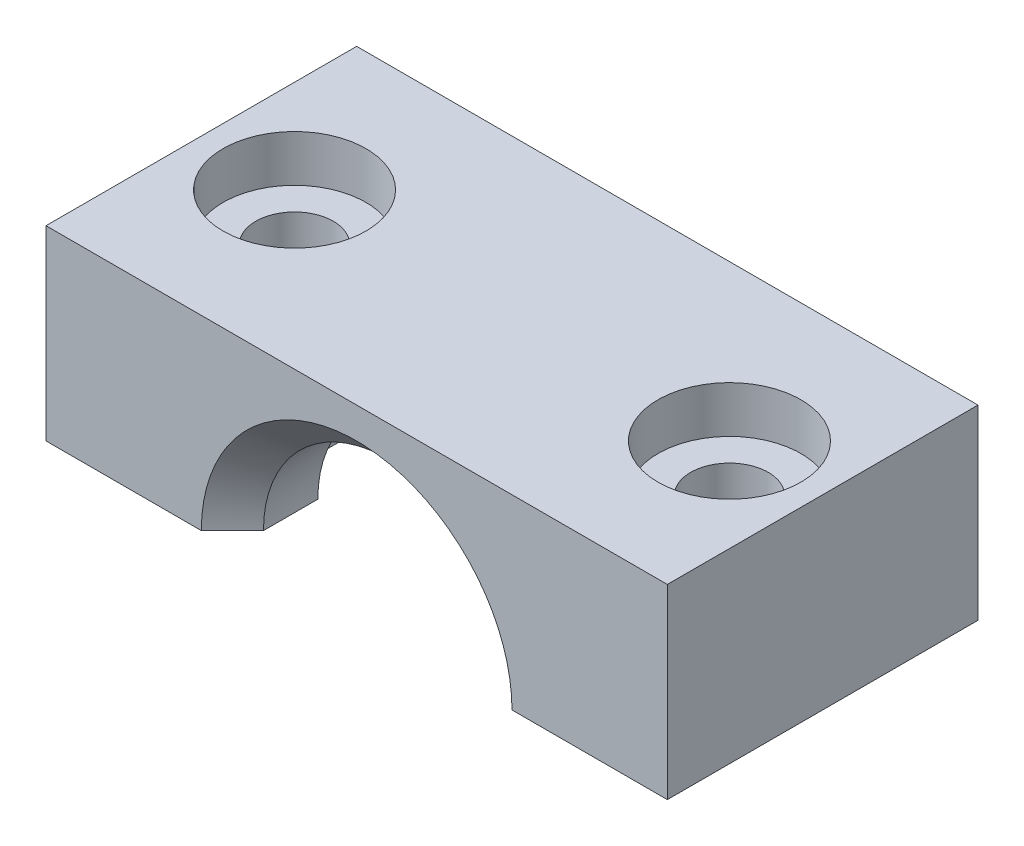
ISO-10303-21;
HEADER;
FILE_DESCRIPTION(('STEP AP214'),'2;1');
FILE_NAME('part.step','',(''),(''),'','','');
FILE_SCHEMA(('AUTOMOTIVE_DESIGN { 1 0 10303 214 1 1 1 1 }'));
ENDSEC;
DATA;
#1=APPLICATION_CONTEXT('core data for automotive mechanical design processes');
#2=APPLICATION_PROTOCOL_DEFINITION('international standard','automotive_design',2000,#1);
#3=PRODUCT_CONTEXT('',#1,'mechanical');
#4=PRODUCT('Part','Part','',(#3));
#5=PRODUCT_RELATED_PRODUCT_CATEGORY('part','',(#4));
#6=PRODUCT_DEFINITION_FORMATION('','',#4);
#7=PRODUCT_DEFINITION_CONTEXT('part definition',#1,'design');
#8=PRODUCT_DEFINITION('design','',#6,#7);
#9=PRODUCT_DEFINITION_SHAPE('','',#8);
#10=(LENGTH_UNIT() NAMED_UNIT(*) SI_UNIT(.MILLI.,.METRE.));
#11=(NAMED_UNIT(*) PLANE_ANGLE_UNIT() SI_UNIT($,.RADIAN.));
#12=(NAMED_UNIT(*) SI_UNIT($,.STERADIAN.) SOLID_ANGLE_UNIT());
#13=UNCERTAINTY_MEASURE_WITH_UNIT(LENGTH_MEASURE(1.E-05),#10,'distance_accuracy_value','');
#14=(GEOMETRIC_REPRESENTATION_CONTEXT(3) GLOBAL_UNCERTAINTY_ASSIGNED_CONTEXT((#13)) GLOBAL_UNIT_ASSIGNED_CONTEXT((#10,
#11,#12)) REPRESENTATION_CONTEXT('',''));
#15=CARTESIAN_POINT('',(0.,0.,0.));
#16=DIRECTION('',(0.,0.,1.));
#17=DIRECTION('',(1.,0.,0.));
#18=AXIS2_PLACEMENT_3D('',#15,#16,#17);
#19=CARTESIAN_POINT('',(-7.,0.,0.));
#20=DIRECTION('',(0.,1.,0.));
#21=DIRECTION('',(0.,0.,1.));
#22=AXIS2_PLACEMENT_3D('',#19,#20,#21);
#23=CYLINDRICAL_SURFACE('',#22,1.25);
#24=CARTESIAN_POINT('',(-7.,0.,0.));
#25=DIRECTION('',(0.,1.,0.));
#26=DIRECTION('',(0.,0.,1.));
#27=AXIS2_PLACEMENT_3D('',#24,#25,#26);
#28=CIRCLE('',#27,1.25);
#29=CARTESIAN_POINT('',(-7.,0.,1.25));
#30=VERTEX_POINT('',#29);
#31=EDGE_CURVE('E144',#30,#30,#28,.T.);
#32=ORIENTED_EDGE('',*,*,#31,.F.);
#33=EDGE_LOOP('',(#32));
#34=FACE_BOUND('',#33,.T.);
#35=CARTESIAN_POINT('',(-7.,4.5,0.));
#36=DIRECTION('',(0.,1.,0.));
#37=DIRECTION('',(0.,0.,1.));
#38=AXIS2_PLACEMENT_3D('',#35,#36,#37);
#39=CIRCLE('',#38,1.25);
#40=CARTESIAN_POINT('',(-7.,4.5,1.25));
#41=VERTEX_POINT('',#40);
#42=EDGE_CURVE('E38',#41,#41,#39,.F.);
#43=ORIENTED_EDGE('',*,*,#42,.F.);
#44=EDGE_LOOP('',(#43));
#45=FACE_BOUND('',#44,.T.);
#46=ADVANCED_FACE('F34',(#34,#45),#23,.F.);
#47=CARTESIAN_POINT('',(7.,0.,0.));
#48=DIRECTION('',(0.,1.,0.));
#49=DIRECTION('',(0.,0.,1.));
#50=AXIS2_PLACEMENT_3D('',#47,#48,#49);
#51=CYLINDRICAL_SURFACE('',#50,1.25);
#52=CARTESIAN_POINT('',(7.,0.,0.));
#53=DIRECTION('',(0.,1.,0.));
#54=DIRECTION('',(0.,0.,1.));
#55=AXIS2_PLACEMENT_3D('',#52,#53,#54);
#56=CIRCLE('',#55,1.25);
#57=CARTESIAN_POINT('',(7.,0.,1.25));
#58=VERTEX_POINT('',#57);
#59=EDGE_CURVE('E219',#58,#58,#56,.T.);
#60=ORIENTED_EDGE('',*,*,#59,.F.);
#61=EDGE_LOOP('',(#60));
#62=FACE_BOUND('',#61,.T.);
#63=CARTESIAN_POINT('',(7.,4.5,0.));
#64=DIRECTION('',(0.,1.,0.));
#65=DIRECTION('',(0.,0.,1.));
#66=AXIS2_PLACEMENT_3D('',#63,#64,#65);
#67=CIRCLE('',#66,1.25);
#68=CARTESIAN_POINT('',(7.,4.5,1.25));
#69=VERTEX_POINT('',#68);
#70=EDGE_CURVE('E213',#69,#69,#67,.F.);
#71=ORIENTED_EDGE('',*,*,#70,.F.);
#72=EDGE_LOOP('',(#71));
#73=FACE_BOUND('',#72,.T.);
#74=ADVANCED_FACE('F244',(#62,#73),#51,.F.);
#75=CARTESIAN_POINT('',(-10.,0.,5.));
#76=DIRECTION('',(0.,1.,0.));
#77=DIRECTION('',(-1.,0.,0.));
#78=AXIS2_PLACEMENT_3D('',#75,#76,#77);
#79=PLANE('',#78);
#80=ORIENTED_EDGE('',*,*,#31,.T.);
#81=EDGE_LOOP('',(#80));
#82=FACE_BOUND('',#81,.T.);
#83=DIRECTION('',(1.,0.,0.));
#84=VECTOR('',#83,1.);
#85=CARTESIAN_POINT('',(-10.,0.,-5.));
#86=LINE('',#85,#84);
#87=CARTESIAN_POINT('',(-10.,0.,-5.));
#88=VERTEX_POINT('',#87);
#89=CARTESIAN_POINT('',(-5.,0.,-5.));
#90=VERTEX_POINT('',#89);
#91=EDGE_CURVE('E181',#88,#90,#86,.T.);
#92=ORIENTED_EDGE('',*,*,#91,.T.);
#93=DIRECTION('',(0.707106781186546,0.,0.707106781186549));
#94=VECTOR('',#93,1.);
#95=CARTESIAN_POINT('',(0.,0.,0.));
#96=LINE('',#95,#94);
#97=CARTESIAN_POINT('',(-4.,0.,-3.99999999999999));
#98=VERTEX_POINT('',#97);
#99=EDGE_CURVE('E205',#90,#98,#96,.T.);
#100=ORIENTED_EDGE('',*,*,#99,.T.);
#101=DIRECTION('',(0.,0.,1.));
#102=VECTOR('',#101,1.);
#103=CARTESIAN_POINT('',(-4.,0.,-5.));
#104=LINE('',#103,#102);
#105=CARTESIAN_POINT('',(-4.,0.,-2.25));
#106=VERTEX_POINT('',#105);
#107=EDGE_CURVE('E163',#98,#106,#104,.T.);
#108=ORIENTED_EDGE('',*,*,#107,.T.);
#109=DIRECTION('',(1.,0.,0.));
#110=VECTOR('',#109,1.);
#111=CARTESIAN_POINT('',(-10.,0.,-2.25));
#112=LINE('',#111,#110);
#113=CARTESIAN_POINT('',(-5.25,0.,-2.25));
#114=VERTEX_POINT('',#113);
#115=EDGE_CURVE('E155',#114,#106,#112,.T.);
#116=ORIENTED_EDGE('',*,*,#115,.F.);
#117=DIRECTION('',(0.,0.,1.));
#118=VECTOR('',#117,1.);
#119=CARTESIAN_POINT('',(-5.25,0.,-2.25));
#120=LINE('',#119,#118);
#121=CARTESIAN_POINT('',(-5.25,0.,2.25));
#122=VERTEX_POINT('',#121);
#123=EDGE_CURVE('E158',#114,#122,#120,.T.);
#124=ORIENTED_EDGE('',*,*,#123,.T.);
#125=DIRECTION('',(1.,0.,0.));
#126=VECTOR('',#125,1.);
#127=CARTESIAN_POINT('',(-10.,0.,2.25));
#128=LINE('',#127,#126);
#129=CARTESIAN_POINT('',(-4.,0.,2.25));
#130=VERTEX_POINT('',#129);
#131=EDGE_CURVE('E143',#122,#130,#128,.T.);
#132=ORIENTED_EDGE('',*,*,#131,.T.);
#133=CARTESIAN_POINT('',(-4.,0.,3.99999999999999));
#134=VERTEX_POINT('',#133);
#135=EDGE_CURVE('E162',#130,#134,#104,.T.);
#136=ORIENTED_EDGE('',*,*,#135,.T.);
#137=DIRECTION('',(-0.707106781186549,0.,0.707106781186546));
#138=VECTOR('',#137,1.);
#139=CARTESIAN_POINT('',(0.,0.,0.));
#140=LINE('',#139,#138);
#141=CARTESIAN_POINT('',(-5.00000000000001,0.,5.));
#142=VERTEX_POINT('',#141);
#143=EDGE_CURVE('E203',#134,#142,#140,.T.);
#144=ORIENTED_EDGE('',*,*,#143,.T.);
#145=DIRECTION('',(1.,0.,0.));
#146=VECTOR('',#145,1.);
#147=CARTESIAN_POINT('',(-10.,0.,5.));
#148=LINE('',#147,#146);
#149=CARTESIAN_POINT('',(-10.,0.,5.));
#150=VERTEX_POINT('',#149);
#151=EDGE_CURVE('E171',#150,#142,#148,.T.);
#152=ORIENTED_EDGE('',*,*,#151,.F.);
#153=DIRECTION('',(0.,0.,-1.));
#154=VECTOR('',#153,1.);
#155=CARTESIAN_POINT('',(-10.,0.,5.));
#156=LINE('',#155,#154);
#157=EDGE_CURVE('E195',#150,#88,#156,.T.);
#158=ORIENTED_EDGE('',*,*,#157,.T.);
#159=EDGE_LOOP('',(#92,#100,#108,#116,#124,#132,#136,#144,#152,#158));
#160=FACE_BOUND('',#159,.T.);
#161=ADVANCED_FACE('F239',(#82,#160),#79,.F.);
#162=ORIENTED_EDGE('',*,*,#59,.T.);
#163=EDGE_LOOP('',(#162));
#164=FACE_BOUND('',#163,.T.);
#165=DIRECTION('',(0.,0.,1.));
#166=VECTOR('',#165,1.);
#167=CARTESIAN_POINT('',(4.,0.,-5.));
#168=LINE('',#167,#166);
#169=CARTESIAN_POINT('',(4.,0.,-2.25));
#170=VERTEX_POINT('',#169);
#171=CARTESIAN_POINT('',(4.,0.,-3.99999999999999));
#172=VERTEX_POINT('',#171);
#173=EDGE_CURVE('E160',#170,#172,#168,.F.);
#174=ORIENTED_EDGE('',*,*,#173,.T.);
#175=DIRECTION('',(0.707106781186546,0.,-0.707106781186549));
#176=VECTOR('',#175,1.);
#177=CARTESIAN_POINT('',(0.,0.,0.));
#178=LINE('',#177,#176);
#179=CARTESIAN_POINT('',(5.,0.,-5.));
#180=VERTEX_POINT('',#179);
#181=EDGE_CURVE('E210',#172,#180,#178,.T.);
#182=ORIENTED_EDGE('',*,*,#181,.T.);
#183=CARTESIAN_POINT('',(10.,0.,-5.));
#184=VERTEX_POINT('',#183);
#185=EDGE_CURVE('E180',#180,#184,#86,.T.);
#186=ORIENTED_EDGE('',*,*,#185,.T.);
#187=DIRECTION('',(0.,0.,-1.));
#188=VECTOR('',#187,1.);
#189=CARTESIAN_POINT('',(10.,0.,5.));
#190=LINE('',#189,#188);
#191=CARTESIAN_POINT('',(10.,0.,5.));
#192=VERTEX_POINT('',#191);
#193=EDGE_CURVE('E192',#192,#184,#190,.T.);
#194=ORIENTED_EDGE('',*,*,#193,.F.);
#195=CARTESIAN_POINT('',(5.00000000000001,0.,5.));
#196=VERTEX_POINT('',#195);
#197=EDGE_CURVE('E169',#196,#192,#148,.T.);
#198=ORIENTED_EDGE('',*,*,#197,.F.);
#199=DIRECTION('',(-0.707106781186549,0.,-0.707106781186546));
#200=VECTOR('',#199,1.);
#201=CARTESIAN_POINT('',(0.,0.,0.));
#202=LINE('',#201,#200);
#203=CARTESIAN_POINT('',(4.,0.,3.99999999999999));
#204=VERTEX_POINT('',#203);
#205=EDGE_CURVE('E51',#196,#204,#202,.T.);
#206=ORIENTED_EDGE('',*,*,#205,.T.);
#207=CARTESIAN_POINT('',(4.,0.,2.25));
#208=VERTEX_POINT('',#207);
#209=EDGE_CURVE('E148',#204,#208,#168,.F.);
#210=ORIENTED_EDGE('',*,*,#209,.T.);
#211=DIRECTION('',(1.,0.,0.));
#212=VECTOR('',#211,1.);
#213=CARTESIAN_POINT('',(-10.,0.,2.25));
#214=LINE('',#213,#212);
#215=CARTESIAN_POINT('',(5.25,0.,2.25));
#216=VERTEX_POINT('',#215);
#217=EDGE_CURVE('E140',#208,#216,#214,.T.);
#218=ORIENTED_EDGE('',*,*,#217,.T.);
#219=DIRECTION('',(0.,0.,1.));
#220=VECTOR('',#219,1.);
#221=CARTESIAN_POINT('',(5.25,0.,-2.25));
#222=LINE('',#221,#220);
#223=CARTESIAN_POINT('',(5.25,0.,-2.25));
#224=VERTEX_POINT('',#223);
#225=EDGE_CURVE('E125',#216,#224,#222,.F.);
#226=ORIENTED_EDGE('',*,*,#225,.T.);
#227=DIRECTION('',(1.,0.,0.));
#228=VECTOR('',#227,1.);
#229=CARTESIAN_POINT('',(-10.,0.,-2.25));
#230=LINE('',#229,#228);
#231=EDGE_CURVE('E150',#170,#224,#230,.T.);
#232=ORIENTED_EDGE('',*,*,#231,.F.);
#233=EDGE_LOOP('',(#174,#182,#186,#194,#198,#206,#210,#218,#226,#232));
#234=FACE_BOUND('',#233,.T.);
#235=ADVANCED_FACE('F147',(#164,#234),#79,.F.);
#236=CARTESIAN_POINT('',(0.,0.,-5.));
#237=DIRECTION('',(0.,0.,1.));
#238=DIRECTION('',(1.,0.,0.));
#239=AXIS2_PLACEMENT_3D('',#236,#237,#238);
#240=CYLINDRICAL_SURFACE('',#239,4.);
#241=ORIENTED_EDGE('',*,*,#107,.F.);
#242=CARTESIAN_POINT('',(0.,0.,-3.99999999999999));
#243=DIRECTION('',(0.,0.,-1.));
#244=DIRECTION('',(-1.,0.,0.));
#245=AXIS2_PLACEMENT_3D('',#242,#243,#244);
#246=CIRCLE('',#245,4.);
#247=EDGE_CURVE('E207',#98,#172,#246,.T.);
#248=ORIENTED_EDGE('',*,*,#247,.T.);
#249=ORIENTED_EDGE('',*,*,#173,.F.);
#250=CARTESIAN_POINT('',(0.,0.,-2.25));
#251=DIRECTION('',(0.,0.,1.));
#252=DIRECTION('',(1.,0.,0.));
#253=AXIS2_PLACEMENT_3D('',#250,#251,#252);
#254=CIRCLE('',#253,4.);
#255=EDGE_CURVE('E135',#106,#170,#254,.F.);
#256=ORIENTED_EDGE('',*,*,#255,.F.);
#257=EDGE_LOOP('',(#241,#248,#249,#256));
#258=FACE_BOUND('',#257,.T.);
#259=ADVANCED_FACE('F283',(#258),#240,.F.);
#260=CARTESIAN_POINT('',(-10.,0.,5.));
#261=DIRECTION('',(1.,0.,0.));
#262=DIRECTION('',(0.,0.,-1.));
#263=AXIS2_PLACEMENT_3D('',#260,#261,#262);
#264=PLANE('',#263);
#265=DIRECTION('',(0.,-1.,0.));
#266=VECTOR('',#265,1.);
#267=CARTESIAN_POINT('',(-10.,0.,-5.));
#268=LINE('',#267,#266);
#269=CARTESIAN_POINT('',(-10.,6.,-5.));
#270=VERTEX_POINT('',#269);
#271=EDGE_CURVE('E165',#270,#88,#268,.T.);
#272=ORIENTED_EDGE('',*,*,#271,.T.);
#273=ORIENTED_EDGE('',*,*,#157,.F.);
#274=DIRECTION('',(0.,-1.,0.));
#275=VECTOR('',#274,1.);
#276=CARTESIAN_POINT('',(-10.,0.,5.));
#277=LINE('',#276,#275);
#278=CARTESIAN_POINT('',(-10.,6.,5.));
#279=VERTEX_POINT('',#278);
#280=EDGE_CURVE('E166',#279,#150,#277,.T.);
#281=ORIENTED_EDGE('',*,*,#280,.F.);
#282=DIRECTION('',(0.,0.,-1.));
#283=VECTOR('',#282,1.);
#284=CARTESIAN_POINT('',(-10.,6.,5.));
#285=LINE('',#284,#283);
#286=EDGE_CURVE('E177',#279,#270,#285,.T.);
#287=ORIENTED_EDGE('',*,*,#286,.T.);
#288=EDGE_LOOP('',(#272,#273,#281,#287));
#289=FACE_BOUND('',#288,.T.);
#290=ADVANCED_FACE('F297',(#289),#264,.F.);
#291=CARTESIAN_POINT('',(10.,0.,5.));
#292=DIRECTION('',(-1.,0.,0.));
#293=DIRECTION('',(0.,0.,1.));
#294=AXIS2_PLACEMENT_3D('',#291,#292,#293);
#295=PLANE('',#294);
#296=DIRECTION('',(0.,1.,0.));
#297=VECTOR('',#296,1.);
#298=CARTESIAN_POINT('',(10.,0.,-5.));
#299=LINE('',#298,#297);
#300=CARTESIAN_POINT('',(10.,6.,-5.));
#301=VERTEX_POINT('',#300);
#302=EDGE_CURVE('E184',#184,#301,#299,.T.);
#303=ORIENTED_EDGE('',*,*,#302,.T.);
#304=DIRECTION('',(0.,0.,-1.));
#305=VECTOR('',#304,1.);
#306=CARTESIAN_POINT('',(10.,6.,5.));
#307=LINE('',#306,#305);
#308=CARTESIAN_POINT('',(10.,6.,5.));
#309=VERTEX_POINT('',#308);
#310=EDGE_CURVE('E189',#309,#301,#307,.T.);
#311=ORIENTED_EDGE('',*,*,#310,.F.);
#312=DIRECTION('',(0.,1.,0.));
#313=VECTOR('',#312,1.);
#314=CARTESIAN_POINT('',(10.,0.,5.));
#315=LINE('',#314,#313);
#316=EDGE_CURVE('E173',#192,#309,#315,.T.);
#317=ORIENTED_EDGE('',*,*,#316,.F.);
#318=ORIENTED_EDGE('',*,*,#193,.T.);
#319=EDGE_LOOP('',(#303,#311,#317,#318));
#320=FACE_BOUND('',#319,.T.);
#321=ADVANCED_FACE('F293',(#320),#295,.F.);
#322=CARTESIAN_POINT('',(-10.,6.,5.));
#323=DIRECTION('',(0.,-1.,0.));
#324=DIRECTION('',(0.,0.,-1.));
#325=AXIS2_PLACEMENT_3D('',#322,#323,#324);
#326=PLANE('',#325);
#327=CARTESIAN_POINT('',(-7.,6.,0.));
#328=DIRECTION('',(0.,1.,0.));
#329=DIRECTION('',(0.,0.,1.));
#330=AXIS2_PLACEMENT_3D('',#327,#328,#329);
#331=CIRCLE('',#330,2.3);
#332=CARTESIAN_POINT('',(-7.,6.,2.3));
#333=VERTEX_POINT('',#332);
#334=EDGE_CURVE('E221',#333,#333,#331,.T.);
#335=ORIENTED_EDGE('',*,*,#334,.F.);
#336=EDGE_LOOP('',(#335));
#337=FACE_BOUND('',#336,.T.);
#338=CARTESIAN_POINT('',(7.,6.,0.));
#339=DIRECTION('',(0.,1.,0.));
#340=DIRECTION('',(0.,0.,1.));
#341=AXIS2_PLACEMENT_3D('',#338,#339,#340);
#342=CIRCLE('',#341,2.3);
#343=CARTESIAN_POINT('',(7.,6.,2.3));
#344=VERTEX_POINT('',#343);
#345=EDGE_CURVE('E231',#344,#344,#342,.T.);
#346=ORIENTED_EDGE('',*,*,#345,.F.);
#347=EDGE_LOOP('',(#346));
#348=FACE_BOUND('',#347,.T.);
#349=DIRECTION('',(-1.,0.,0.));
#350=VECTOR('',#349,1.);
#351=CARTESIAN_POINT('',(-10.,6.,-5.));
#352=LINE('',#351,#350);
#353=EDGE_CURVE('E170',#301,#270,#352,.T.);
#354=ORIENTED_EDGE('',*,*,#353,.T.);
#355=ORIENTED_EDGE('',*,*,#286,.F.);
#356=DIRECTION('',(-1.,0.,0.));
#357=VECTOR('',#356,1.);
#358=CARTESIAN_POINT('',(-10.,6.,5.));
#359=LINE('',#358,#357);
#360=EDGE_CURVE('E175',#309,#279,#359,.T.);
#361=ORIENTED_EDGE('',*,*,#360,.F.);
#362=ORIENTED_EDGE('',*,*,#310,.T.);
#363=EDGE_LOOP('',(#354,#355,#361,#362));
#364=FACE_BOUND('',#363,.T.);
#365=ADVANCED_FACE('F287',(#337,#348,#364),#326,.F.);
#366=CARTESIAN_POINT('',(0.,0.,5.));
#367=DIRECTION('',(0.,0.,-1.));
#368=DIRECTION('',(-1.,0.,0.));
#369=AXIS2_PLACEMENT_3D('',#366,#367,#368);
#370=PLANE('',#369);
#371=ORIENTED_EDGE('',*,*,#151,.T.);
#372=CARTESIAN_POINT('',(0.,0.,5.));
#373=DIRECTION('',(0.,0.,-1.));
#374=DIRECTION('',(-1.,0.,0.));
#375=AXIS2_PLACEMENT_3D('',#372,#373,#374);
#376=CIRCLE('',#375,5.00000000000001);
#377=EDGE_CURVE('E11',#142,#196,#376,.T.);
#378=ORIENTED_EDGE('',*,*,#377,.T.);
#379=ORIENTED_EDGE('',*,*,#197,.T.);
#380=ORIENTED_EDGE('',*,*,#316,.T.);
#381=ORIENTED_EDGE('',*,*,#360,.T.);
#382=ORIENTED_EDGE('',*,*,#280,.T.);
#383=EDGE_LOOP('',(#371,#378,#379,#380,#381,#382));
#384=FACE_BOUND('',#383,.T.);
#385=ADVANCED_FACE('F284',(#384),#370,.F.);
#386=CARTESIAN_POINT('',(0.,0.,-5.));
#387=DIRECTION('',(0.,0.,-1.));
#388=DIRECTION('',(-1.,0.,0.));
#389=AXIS2_PLACEMENT_3D('',#386,#387,#388);
#390=PLANE('',#389);
#391=ORIENTED_EDGE('',*,*,#185,.F.);
#392=CARTESIAN_POINT('',(0.,0.,-5.));
#393=DIRECTION('',(0.,0.,-1.));
#394=DIRECTION('',(-1.,0.,0.));
#395=AXIS2_PLACEMENT_3D('',#392,#393,#394);
#396=CIRCLE('',#395,5.);
#397=EDGE_CURVE('E134',#180,#90,#396,.F.);
#398=ORIENTED_EDGE('',*,*,#397,.T.);
#399=ORIENTED_EDGE('',*,*,#91,.F.);
#400=ORIENTED_EDGE('',*,*,#271,.F.);
#401=ORIENTED_EDGE('',*,*,#353,.F.);
#402=ORIENTED_EDGE('',*,*,#302,.F.);
#403=EDGE_LOOP('',(#391,#398,#399,#400,#401,#402));
#404=FACE_BOUND('',#403,.T.);
#405=ADVANCED_FACE('F281',(#404),#390,.T.);
#406=ORIENTED_EDGE('',*,*,#209,.F.);
#407=CARTESIAN_POINT('',(0.,0.,3.99999999999999));
#408=DIRECTION('',(0.,0.,-1.));
#409=DIRECTION('',(-1.,0.,0.));
#410=AXIS2_PLACEMENT_3D('',#407,#408,#409);
#411=CIRCLE('',#410,4.);
#412=EDGE_CURVE('E43',#204,#134,#411,.F.);
#413=ORIENTED_EDGE('',*,*,#412,.T.);
#414=ORIENTED_EDGE('',*,*,#135,.F.);
#415=CARTESIAN_POINT('',(0.,0.,2.25));
#416=DIRECTION('',(0.,0.,1.));
#417=DIRECTION('',(1.,0.,0.));
#418=AXIS2_PLACEMENT_3D('',#415,#416,#417);
#419=CIRCLE('',#418,4.);
#420=EDGE_CURVE('E198',#130,#208,#419,.F.);
#421=ORIENTED_EDGE('',*,*,#420,.T.);
#422=EDGE_LOOP('',(#406,#413,#414,#421));
#423=FACE_BOUND('',#422,.T.);
#424=ADVANCED_FACE('F278',(#423),#240,.F.);
#425=CARTESIAN_POINT('',(0.,0.,-2.25));
#426=DIRECTION('',(0.,0.,1.));
#427=DIRECTION('',(1.,0.,0.));
#428=AXIS2_PLACEMENT_3D('',#425,#426,#427);
#429=CYLINDRICAL_SURFACE('',#428,5.25);
#430=CARTESIAN_POINT('',(0.,0.,-2.25));
#431=DIRECTION('',(0.,0.,1.));
#432=DIRECTION('',(1.,0.,0.));
#433=AXIS2_PLACEMENT_3D('',#430,#431,#432);
#434=CIRCLE('',#433,5.25);
#435=EDGE_CURVE('E131',#224,#114,#434,.T.);
#436=ORIENTED_EDGE('',*,*,#435,.F.);
#437=ORIENTED_EDGE('',*,*,#225,.F.);
#438=CARTESIAN_POINT('',(0.,0.,2.25));
#439=DIRECTION('',(0.,0.,1.));
#440=DIRECTION('',(1.,0.,0.));
#441=AXIS2_PLACEMENT_3D('',#438,#439,#440);
#442=CIRCLE('',#441,5.25);
#443=EDGE_CURVE('E128',#216,#122,#442,.T.);
#444=ORIENTED_EDGE('',*,*,#443,.T.);
#445=ORIENTED_EDGE('',*,*,#123,.F.);
#446=EDGE_LOOP('',(#436,#437,#444,#445));
#447=FACE_BOUND('',#446,.T.);
#448=ADVANCED_FACE('F127',(#447),#429,.F.);
#449=CARTESIAN_POINT('',(0.,0.,-2.25));
#450=DIRECTION('',(0.,0.,1.));
#451=DIRECTION('',(1.,0.,0.));
#452=AXIS2_PLACEMENT_3D('',#449,#450,#451);
#453=PLANE('',#452);
#454=ORIENTED_EDGE('',*,*,#115,.T.);
#455=ORIENTED_EDGE('',*,*,#255,.T.);
#456=ORIENTED_EDGE('',*,*,#231,.T.);
#457=ORIENTED_EDGE('',*,*,#435,.T.);
#458=EDGE_LOOP('',(#454,#455,#456,#457));
#459=FACE_BOUND('',#458,.T.);
#460=ADVANCED_FACE('F269',(#459),#453,.T.);
#461=CARTESIAN_POINT('',(0.,0.,2.25));
#462=DIRECTION('',(0.,0.,1.));
#463=DIRECTION('',(1.,0.,0.));
#464=AXIS2_PLACEMENT_3D('',#461,#462,#463);
#465=PLANE('',#464);
#466=ORIENTED_EDGE('',*,*,#443,.F.);
#467=ORIENTED_EDGE('',*,*,#217,.F.);
#468=ORIENTED_EDGE('',*,*,#420,.F.);
#469=ORIENTED_EDGE('',*,*,#131,.F.);
#470=EDGE_LOOP('',(#466,#467,#468,#469));
#471=FACE_BOUND('',#470,.T.);
#472=ADVANCED_FACE('F139',(#471),#465,.F.);
#473=CARTESIAN_POINT('',(0.,0.,-5.));
#474=DIRECTION('',(0.,0.,-1.));
#475=DIRECTION('',(-1.,0.,0.));
#476=AXIS2_PLACEMENT_3D('',#473,#474,#475);
#477=CONICAL_SURFACE('',#476,5.,0.785398163397447);
#478=ORIENTED_EDGE('',*,*,#181,.F.);
#479=ORIENTED_EDGE('',*,*,#247,.F.);
#480=ORIENTED_EDGE('',*,*,#99,.F.);
#481=ORIENTED_EDGE('',*,*,#397,.F.);
#482=EDGE_LOOP('',(#478,#479,#480,#481));
#483=FACE_BOUND('',#482,.T.);
#484=ADVANCED_FACE('F275',(#483),#477,.F.);
#485=CARTESIAN_POINT('',(0.,0.,3.99999999999999));
#486=DIRECTION('',(0.,0.,1.));
#487=DIRECTION('',(1.,0.,0.));
#488=AXIS2_PLACEMENT_3D('',#485,#486,#487);
#489=CONICAL_SURFACE('',#488,4.,0.78539816339745);
#490=ORIENTED_EDGE('',*,*,#205,.F.);
#491=ORIENTED_EDGE('',*,*,#377,.F.);
#492=ORIENTED_EDGE('',*,*,#143,.F.);
#493=ORIENTED_EDGE('',*,*,#412,.F.);
#494=EDGE_LOOP('',(#490,#491,#492,#493));
#495=FACE_BOUND('',#494,.T.);
#496=ADVANCED_FACE('F36',(#495),#489,.F.);
#497=CARTESIAN_POINT('',(7.,4.5,0.));
#498=DIRECTION('',(0.,1.,0.));
#499=DIRECTION('',(0.,0.,1.));
#500=AXIS2_PLACEMENT_3D('',#497,#498,#499);
#501=PLANE('',#500);
#502=CARTESIAN_POINT('',(7.,4.5,0.));
#503=DIRECTION('',(0.,1.,0.));
#504=DIRECTION('',(0.,0.,1.));
#505=AXIS2_PLACEMENT_3D('',#502,#503,#504);
#506=CIRCLE('',#505,2.3);
#507=CARTESIAN_POINT('',(7.,4.5,2.3));
#508=VERTEX_POINT('',#507);
#509=EDGE_CURVE('E226',#508,#508,#506,.T.);
#510=ORIENTED_EDGE('',*,*,#509,.T.);
#511=EDGE_LOOP('',(#510));
#512=FACE_BOUND('',#511,.T.);
#513=ORIENTED_EDGE('',*,*,#70,.T.);
#514=EDGE_LOOP('',(#513));
#515=FACE_BOUND('',#514,.T.);
#516=ADVANCED_FACE('F259',(#512,#515),#501,.T.);
#517=CARTESIAN_POINT('',(7.,4.5,0.));
#518=DIRECTION('',(0.,1.,0.));
#519=DIRECTION('',(0.,0.,1.));
#520=AXIS2_PLACEMENT_3D('',#517,#518,#519);
#521=CYLINDRICAL_SURFACE('',#520,2.3);
#522=ORIENTED_EDGE('',*,*,#509,.F.);
#523=EDGE_LOOP('',(#522));
#524=FACE_BOUND('',#523,.T.);
#525=ORIENTED_EDGE('',*,*,#345,.T.);
#526=EDGE_LOOP('',(#525));
#527=FACE_BOUND('',#526,.T.);
#528=ADVANCED_FACE('F251',(#524,#527),#521,.F.);
#529=CARTESIAN_POINT('',(-7.,4.5,0.));
#530=DIRECTION('',(0.,1.,0.));
#531=DIRECTION('',(0.,0.,1.));
#532=AXIS2_PLACEMENT_3D('',#529,#530,#531);
#533=PLANE('',#532);
#534=CARTESIAN_POINT('',(-7.,4.5,0.));
#535=DIRECTION('',(0.,1.,0.));
#536=DIRECTION('',(0.,0.,1.));
#537=AXIS2_PLACEMENT_3D('',#534,#535,#536);
#538=CIRCLE('',#537,2.3);
#539=CARTESIAN_POINT('',(-7.,4.5,2.3));
#540=VERTEX_POINT('',#539);
#541=EDGE_CURVE('E215',#540,#540,#538,.T.);
#542=ORIENTED_EDGE('',*,*,#541,.T.);
#543=EDGE_LOOP('',(#542));
#544=FACE_BOUND('',#543,.T.);
#545=ORIENTED_EDGE('',*,*,#42,.T.);
#546=EDGE_LOOP('',(#545));
#547=FACE_BOUND('',#546,.T.);
#548=ADVANCED_FACE('F248',(#544,#547),#533,.T.);
#549=CARTESIAN_POINT('',(-7.,4.5,0.));
#550=DIRECTION('',(0.,1.,0.));
#551=DIRECTION('',(0.,0.,1.));
#552=AXIS2_PLACEMENT_3D('',#549,#550,#551);
#553=CYLINDRICAL_SURFACE('',#552,2.3);
#554=ORIENTED_EDGE('',*,*,#541,.F.);
#555=EDGE_LOOP('',(#554));
#556=FACE_BOUND('',#555,.T.);
#557=ORIENTED_EDGE('',*,*,#334,.T.);
#558=EDGE_LOOP('',(#557));
#559=FACE_BOUND('',#558,.T.);
#560=ADVANCED_FACE('F250',(#556,#559),#553,.F.);
#561=CLOSED_SHELL('',(#46,#74,#161,#235,#259,#290,#321,#365,#385,#405,#424,#448,#460,#472,#484,
#496,#516,#528,#548,#560));
#562=MANIFOLD_SOLID_BREP('B2',#561);
#563=ADVANCED_BREP_SHAPE_REPRESENTATION('',(#18,#562),#14);
#564=SHAPE_DEFINITION_REPRESENTATION(#9,#563);
ENDSEC;
END-ISO-10303-21;
